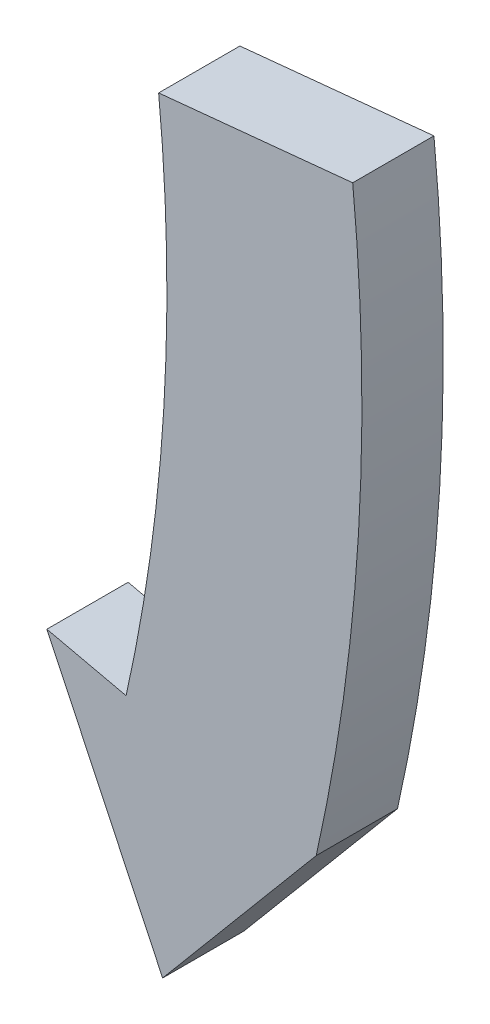
ISO-10303-21;
HEADER;
FILE_DESCRIPTION(('STEP AP214'),'2;1');
FILE_NAME('part.step','',(''),(''),'','','');
FILE_SCHEMA(('AUTOMOTIVE_DESIGN { 1 0 10303 214 1 1 1 1 }'));
ENDSEC;
DATA;
#1=APPLICATION_CONTEXT('core data for automotive mechanical design processes');
#2=APPLICATION_PROTOCOL_DEFINITION('international standard','automotive_design',2000,#1);
#3=PRODUCT_CONTEXT('',#1,'mechanical');
#4=PRODUCT('Part','Part','',(#3));
#5=PRODUCT_RELATED_PRODUCT_CATEGORY('part','',(#4));
#6=PRODUCT_DEFINITION_FORMATION('','',#4);
#7=PRODUCT_DEFINITION_CONTEXT('part definition',#1,'design');
#8=PRODUCT_DEFINITION('design','',#6,#7);
#9=PRODUCT_DEFINITION_SHAPE('','',#8);
#10=(LENGTH_UNIT() NAMED_UNIT(*) SI_UNIT(.MILLI.,.METRE.));
#11=(NAMED_UNIT(*) PLANE_ANGLE_UNIT() SI_UNIT($,.RADIAN.));
#12=(NAMED_UNIT(*) SI_UNIT($,.STERADIAN.) SOLID_ANGLE_UNIT());
#13=UNCERTAINTY_MEASURE_WITH_UNIT(LENGTH_MEASURE(1.E-05),#10,'distance_accuracy_value','');
#14=(GEOMETRIC_REPRESENTATION_CONTEXT(3) GLOBAL_UNCERTAINTY_ASSIGNED_CONTEXT((#13)) GLOBAL_UNIT_ASSIGNED_CONTEXT((#10,
#11,#12)) REPRESENTATION_CONTEXT('',''));
#15=CARTESIAN_POINT('',(0.,0.,0.));
#16=DIRECTION('',(0.,0.,1.));
#17=DIRECTION('',(1.,0.,0.));
#18=AXIS2_PLACEMENT_3D('',#15,#16,#17);
#19=CARTESIAN_POINT('',(9.40768222571172E-10,1.61202306188246E-13,57.0946725318637));
#20=DIRECTION('',(0.,0.,1.));
#21=DIRECTION('',(0.,-1.,0.));
#22=AXIS2_PLACEMENT_3D('',#19,#20,#21);
#23=PLANE('',#22);
#24=DIRECTION('',(0.428355178416056,-0.903610447662126,0.));
#25=VECTOR('',#24,1.);
#26=CARTESIAN_POINT('',(9.74055686423841,-2.16960369385251,57.0946725318637));
#27=LINE('',#26,#25);
#28=CARTESIAN_POINT('',(9.74055686423841,-2.16960369385251,57.0946725318637));
#29=VERTEX_POINT('',#28);
#30=CARTESIAN_POINT('',(10.452933382148,-3.67235397373133,57.0946725318637));
#31=VERTEX_POINT('',#30);
#32=EDGE_CURVE('E103',#29,#31,#27,.T.);
#33=ORIENTED_EDGE('',*,*,#32,.F.);
#34=DIRECTION('',(-0.975201432738521,0.221319148707778,0.));
#35=VECTOR('',#34,1.);
#36=CARTESIAN_POINT('',(10.2281613054085,-2.28026411353919,57.0946725318637));
#37=LINE('',#36,#35);
#38=CARTESIAN_POINT('',(10.2281613054085,-2.28026411353919,57.0946725318637));
#39=VERTEX_POINT('',#38);
#40=EDGE_CURVE('E106',#39,#29,#37,.T.);
#41=ORIENTED_EDGE('',*,*,#40,.F.);
#42=CARTESIAN_POINT('',(9.40768222571172E-10,1.61202306188246E-13,57.0946725318637));
#43=DIRECTION('',(0.,0.,-1.));
#44=DIRECTION('',(0.,1.,0.));
#45=AXIS2_PLACEMENT_3D('',#42,#43,#44);
#46=CIRCLE('',#45,10.4792599021929);
#47=CARTESIAN_POINT('',(10.4283005355064,1.03219962143279,57.0946725318637));
#48=VERTEX_POINT('',#47);
#49=EDGE_CURVE('E76',#39,#48,#46,.F.);
#50=ORIENTED_EDGE('',*,*,#49,.T.);
#51=DIRECTION('',(0.995137121504489,0.0984992863109181,0.));
#52=VECTOR('',#51,1.);
#53=CARTESIAN_POINT('',(10.4283005355064,1.03219962143278,57.0946725318637));
#54=LINE('',#53,#52);
#55=CARTESIAN_POINT('',(11.6224650813118,1.15039876500589,57.0946725318637));
#56=VERTEX_POINT('',#55);
#57=EDGE_CURVE('E71',#48,#56,#54,.T.);
#58=ORIENTED_EDGE('',*,*,#57,.T.);
#59=CARTESIAN_POINT('',(9.40768222571172E-10,1.61202306188246E-13,57.0946725318637));
#60=DIRECTION('',(0.,0.,-1.));
#61=DIRECTION('',(0.,1.,0.));
#62=AXIS2_PLACEMENT_3D('',#59,#60,#61);
#63=CIRCLE('',#62,11.6792599021929);
#64=CARTESIAN_POINT('',(11.3980528535871,-2.54745030005498,57.0946725318637));
#65=VERTEX_POINT('',#64);
#66=EDGE_CURVE('E19',#65,#56,#63,.F.);
#67=ORIENTED_EDGE('',*,*,#66,.F.);
#68=DIRECTION('',(-0.643272047408355,-0.7656376904405,0.));
#69=VECTOR('',#68,1.);
#70=CARTESIAN_POINT('',(11.3980528535871,-2.54745030005501,57.0946725318637));
#71=LINE('',#70,#69);
#72=EDGE_CURVE('E66',#65,#31,#71,.T.);
#73=ORIENTED_EDGE('',*,*,#72,.T.);
#74=EDGE_LOOP('',(#33,#41,#50,#58,#67,#73));
#75=FACE_BOUND('',#74,.T.);
#76=ADVANCED_FACE('F16',(#75),#23,.F.);
#77=CARTESIAN_POINT('',(11.3980528535871,-2.54745030005501,57.0946725318637));
#78=DIRECTION('',(-0.7656376904405,0.643272047408355,0.));
#79=DIRECTION('',(-0.643272047408355,-0.7656376904405,0.));
#80=AXIS2_PLACEMENT_3D('',#77,#78,#79);
#81=PLANE('',#80);
#82=DIRECTION('',(0.,0.,1.));
#83=VECTOR('',#82,1.);
#84=CARTESIAN_POINT('',(10.452933382148,-3.67235397373133,57.0946725318637));
#85=LINE('',#84,#83);
#86=CARTESIAN_POINT('',(10.452933382148,-3.67235397373133,57.5946725318637));
#87=VERTEX_POINT('',#86);
#88=EDGE_CURVE('E97',#87,#31,#85,.F.);
#89=ORIENTED_EDGE('',*,*,#88,.T.);
#90=ORIENTED_EDGE('',*,*,#72,.F.);
#91=DIRECTION('',(0.,0.,-1.));
#92=VECTOR('',#91,1.);
#93=CARTESIAN_POINT('',(11.3980528535871,-2.547450300055,57.0946725318637));
#94=LINE('',#93,#92);
#95=CARTESIAN_POINT('',(11.3980528535871,-2.54745030005498,57.5946725318637));
#96=VERTEX_POINT('',#95);
#97=EDGE_CURVE('E86',#96,#65,#94,.T.);
#98=ORIENTED_EDGE('',*,*,#97,.F.);
#99=DIRECTION('',(0.643272047408368,0.765637690440489,0.));
#100=VECTOR('',#99,1.);
#101=CARTESIAN_POINT('',(10.452933382148,-3.67235397373133,57.5946725318637));
#102=LINE('',#101,#100);
#103=EDGE_CURVE('E117',#87,#96,#102,.T.);
#104=ORIENTED_EDGE('',*,*,#103,.F.);
#105=EDGE_LOOP('',(#89,#90,#98,#104));
#106=FACE_BOUND('',#105,.T.);
#107=ADVANCED_FACE('F154',(#106),#81,.F.);
#108=CARTESIAN_POINT('',(9.40768222571172E-10,1.61202306188246E-13,57.0946725318637));
#109=DIRECTION('',(0.,0.,-1.));
#110=DIRECTION('',(0.,1.,0.));
#111=AXIS2_PLACEMENT_3D('',#108,#109,#110);
#112=CYLINDRICAL_SURFACE('',#111,11.6792599021929);
#113=ORIENTED_EDGE('',*,*,#66,.T.);
#114=DIRECTION('',(0.,0.,1.));
#115=VECTOR('',#114,1.);
#116=CARTESIAN_POINT('',(11.6224650813118,1.15039876500589,57.0946725318637));
#117=LINE('',#116,#115);
#118=CARTESIAN_POINT('',(11.6224650813118,1.15039876500588,57.5946725318637));
#119=VERTEX_POINT('',#118);
#120=EDGE_CURVE('E80',#56,#119,#117,.T.);
#121=ORIENTED_EDGE('',*,*,#120,.T.);
#122=CARTESIAN_POINT('',(9.40768222571172E-10,1.61232921347091E-13,57.5946725318637));
#123=DIRECTION('',(0.,0.,-1.));
#124=DIRECTION('',(0.,1.,0.));
#125=AXIS2_PLACEMENT_3D('',#122,#123,#124);
#126=CIRCLE('',#125,11.6792599021929);
#127=EDGE_CURVE('E116',#96,#119,#126,.F.);
#128=ORIENTED_EDGE('',*,*,#127,.F.);
#129=ORIENTED_EDGE('',*,*,#97,.T.);
#130=EDGE_LOOP('',(#113,#121,#128,#129));
#131=FACE_BOUND('',#130,.T.);
#132=ADVANCED_FACE('F83',(#131),#112,.T.);
#133=CARTESIAN_POINT('',(10.4283005355064,1.03219962143278,57.0946725318637));
#134=DIRECTION('',(0.0984992863109181,-0.995137121504489,0.));
#135=DIRECTION('',(0.995137121504489,0.0984992863109181,0.));
#136=AXIS2_PLACEMENT_3D('',#133,#134,#135);
#137=PLANE('',#136);
#138=ORIENTED_EDGE('',*,*,#120,.F.);
#139=ORIENTED_EDGE('',*,*,#57,.F.);
#140=DIRECTION('',(0.,0.,-1.));
#141=VECTOR('',#140,1.);
#142=CARTESIAN_POINT('',(10.4283005355064,1.03219962143279,57.0946725318637));
#143=LINE('',#142,#141);
#144=CARTESIAN_POINT('',(10.4283005355064,1.03219962143279,57.5946725318637));
#145=VERTEX_POINT('',#144);
#146=EDGE_CURVE('E92',#48,#145,#143,.F.);
#147=ORIENTED_EDGE('',*,*,#146,.T.);
#148=DIRECTION('',(-0.995137121504489,-0.0984992863109156,0.));
#149=VECTOR('',#148,1.);
#150=CARTESIAN_POINT('',(11.6224650813118,1.15039876500588,57.5946725318637));
#151=LINE('',#150,#149);
#152=EDGE_CURVE('E89',#119,#145,#151,.T.);
#153=ORIENTED_EDGE('',*,*,#152,.F.);
#154=EDGE_LOOP('',(#138,#139,#147,#153));
#155=FACE_BOUND('',#154,.T.);
#156=ADVANCED_FACE('F87',(#155),#137,.F.);
#157=CARTESIAN_POINT('',(9.40768222571172E-10,1.61202306188246E-13,57.0946725318637));
#158=DIRECTION('',(0.,0.,-1.));
#159=DIRECTION('',(0.,1.,0.));
#160=AXIS2_PLACEMENT_3D('',#157,#158,#159);
#161=CYLINDRICAL_SURFACE('',#160,10.4792599021929);
#162=ORIENTED_EDGE('',*,*,#146,.F.);
#163=ORIENTED_EDGE('',*,*,#49,.F.);
#164=DIRECTION('',(0.,0.,1.));
#165=VECTOR('',#164,1.);
#166=CARTESIAN_POINT('',(10.2281613054085,-2.28026411353918,57.0946725318637));
#167=LINE('',#166,#165);
#168=CARTESIAN_POINT('',(10.2281613054085,-2.28026411353919,57.5946725318637));
#169=VERTEX_POINT('',#168);
#170=EDGE_CURVE('E99',#39,#169,#167,.T.);
#171=ORIENTED_EDGE('',*,*,#170,.T.);
#172=CARTESIAN_POINT('',(9.40768222571172E-10,1.61232921347091E-13,57.5946725318637));
#173=DIRECTION('',(0.,0.,-1.));
#174=DIRECTION('',(0.,1.,0.));
#175=AXIS2_PLACEMENT_3D('',#172,#173,#174);
#176=CIRCLE('',#175,10.4792599021929);
#177=EDGE_CURVE('E113',#145,#169,#176,.T.);
#178=ORIENTED_EDGE('',*,*,#177,.F.);
#179=EDGE_LOOP('',(#162,#163,#171,#178));
#180=FACE_BOUND('',#179,.T.);
#181=ADVANCED_FACE('F133',(#180),#161,.F.);
#182=CARTESIAN_POINT('',(9.74055686423841,-2.16960369385251,57.0946725318637));
#183=DIRECTION('',(-0.221319148707764,-0.975201432738524,0.));
#184=DIRECTION('',(0.975201432738524,-0.221319148707764,0.));
#185=AXIS2_PLACEMENT_3D('',#182,#183,#184);
#186=PLANE('',#185);
#187=ORIENTED_EDGE('',*,*,#170,.F.);
#188=ORIENTED_EDGE('',*,*,#40,.T.);
#189=DIRECTION('',(0.,0.,1.));
#190=VECTOR('',#189,1.);
#191=CARTESIAN_POINT('',(9.7405568642384,-2.16960369385251,57.0946725318637));
#192=LINE('',#191,#190);
#193=CARTESIAN_POINT('',(9.74055686423841,-2.16960369385251,57.5946725318637));
#194=VERTEX_POINT('',#193);
#195=EDGE_CURVE('E34',#29,#194,#192,.T.);
#196=ORIENTED_EDGE('',*,*,#195,.T.);
#197=DIRECTION('',(-0.975201432738521,0.221319148707778,0.));
#198=VECTOR('',#197,1.);
#199=CARTESIAN_POINT('',(10.2281613054085,-2.28026411353919,57.5946725318637));
#200=LINE('',#199,#198);
#201=EDGE_CURVE('E25',#169,#194,#200,.T.);
#202=ORIENTED_EDGE('',*,*,#201,.F.);
#203=EDGE_LOOP('',(#187,#188,#196,#202));
#204=FACE_BOUND('',#203,.T.);
#205=ADVANCED_FACE('F143',(#204),#186,.F.);
#206=CARTESIAN_POINT('',(10.452933382148,-3.67235397373133,57.0946725318637));
#207=DIRECTION('',(0.903610447662124,0.428355178416061,0.));
#208=DIRECTION('',(-0.428355178416061,0.903610447662124,0.));
#209=AXIS2_PLACEMENT_3D('',#206,#207,#208);
#210=PLANE('',#209);
#211=ORIENTED_EDGE('',*,*,#195,.F.);
#212=ORIENTED_EDGE('',*,*,#32,.T.);
#213=ORIENTED_EDGE('',*,*,#88,.F.);
#214=DIRECTION('',(0.428355178416056,-0.903610447662126,0.));
#215=VECTOR('',#214,1.);
#216=CARTESIAN_POINT('',(9.74055686423841,-2.16960369385251,57.5946725318637));
#217=LINE('',#216,#215);
#218=EDGE_CURVE('E11',#194,#87,#217,.T.);
#219=ORIENTED_EDGE('',*,*,#218,.F.);
#220=EDGE_LOOP('',(#211,#212,#213,#219));
#221=FACE_BOUND('',#220,.T.);
#222=ADVANCED_FACE('F137',(#221),#210,.F.);
#223=CARTESIAN_POINT('',(9.40768222571172E-10,1.61232921347091E-13,57.5946725318637));
#224=DIRECTION('',(0.,0.,1.));
#225=DIRECTION('',(0.,-1.,0.));
#226=AXIS2_PLACEMENT_3D('',#223,#224,#225);
#227=PLANE('',#226);
#228=ORIENTED_EDGE('',*,*,#201,.T.);
#229=ORIENTED_EDGE('',*,*,#218,.T.);
#230=ORIENTED_EDGE('',*,*,#103,.T.);
#231=ORIENTED_EDGE('',*,*,#127,.T.);
#232=ORIENTED_EDGE('',*,*,#152,.T.);
#233=ORIENTED_EDGE('',*,*,#177,.T.);
#234=EDGE_LOOP('',(#228,#229,#230,#231,#232,#233));
#235=FACE_BOUND('',#234,.T.);
#236=ADVANCED_FACE('F135',(#235),#227,.T.);
#237=CLOSED_SHELL('',(#76,#107,#132,#156,#181,#205,#222,#236));
#238=MANIFOLD_SOLID_BREP('B1',#237);
#239=ADVANCED_BREP_SHAPE_REPRESENTATION('',(#18,#238),#14);
#240=SHAPE_DEFINITION_REPRESENTATION(#9,#239);
ENDSEC;
END-ISO-10303-21;
